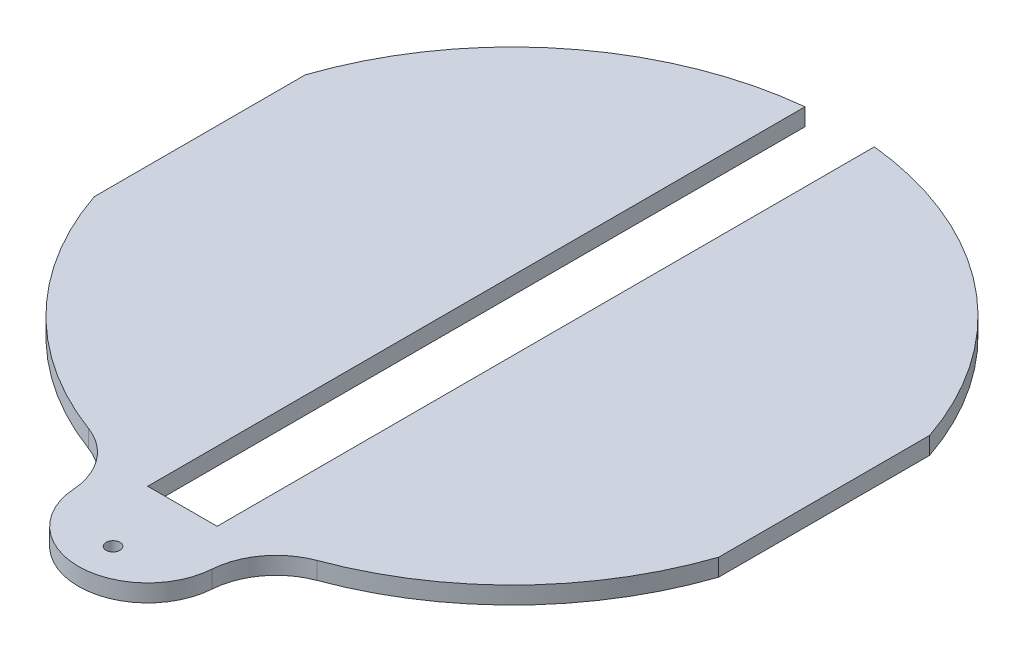
ISO-10303-21;
HEADER;
FILE_DESCRIPTION(('STEP AP214'),'2;1');
FILE_NAME('part.step','',(''),(''),'','','');
FILE_SCHEMA(('AUTOMOTIVE_DESIGN { 1 0 10303 214 1 1 1 1 }'));
ENDSEC;
DATA;
#1=APPLICATION_CONTEXT('core data for automotive mechanical design processes');
#2=APPLICATION_PROTOCOL_DEFINITION('international standard','automotive_design',2000,#1);
#3=PRODUCT_CONTEXT('',#1,'mechanical');
#4=PRODUCT('Part','Part','',(#3));
#5=PRODUCT_RELATED_PRODUCT_CATEGORY('part','',(#4));
#6=PRODUCT_DEFINITION_FORMATION('','',#4);
#7=PRODUCT_DEFINITION_CONTEXT('part definition',#1,'design');
#8=PRODUCT_DEFINITION('design','',#6,#7);
#9=PRODUCT_DEFINITION_SHAPE('','',#8);
#10=(LENGTH_UNIT() NAMED_UNIT(*) SI_UNIT(.MILLI.,.METRE.));
#11=(NAMED_UNIT(*) PLANE_ANGLE_UNIT() SI_UNIT($,.RADIAN.));
#12=(NAMED_UNIT(*) SI_UNIT($,.STERADIAN.) SOLID_ANGLE_UNIT());
#13=UNCERTAINTY_MEASURE_WITH_UNIT(LENGTH_MEASURE(1.E-05),#10,'distance_accuracy_value','');
#14=(GEOMETRIC_REPRESENTATION_CONTEXT(3) GLOBAL_UNCERTAINTY_ASSIGNED_CONTEXT((#13)) GLOBAL_UNIT_ASSIGNED_CONTEXT((#10,
#11,#12)) REPRESENTATION_CONTEXT('',''));
#15=CARTESIAN_POINT('',(0.,0.,0.));
#16=DIRECTION('',(0.,0.,1.));
#17=DIRECTION('',(1.,0.,0.));
#18=AXIS2_PLACEMENT_3D('',#15,#16,#17);
#19=CARTESIAN_POINT('',(-57.15,3.175,63.5));
#20=DIRECTION('',(-1.,0.,0.));
#21=DIRECTION('',(0.,0.,1.));
#22=AXIS2_PLACEMENT_3D('',#19,#20,#21);
#23=PLANE('',#22);
#24=DIRECTION('',(0.,0.,-1.));
#25=VECTOR('',#24,1.);
#26=CARTESIAN_POINT('',(-57.15,3.175,63.5));
#27=LINE('',#26,#25);
#28=CARTESIAN_POINT('',(-57.15,3.175,16.1377710336968));
#29=VERTEX_POINT('',#28);
#30=CARTESIAN_POINT('',(-57.15,3.175,-22.4877710336968));
#31=VERTEX_POINT('',#30);
#32=EDGE_CURVE('E174',#29,#31,#27,.T.);
#33=ORIENTED_EDGE('',*,*,#32,.T.);
#34=DIRECTION('',(0.,1.,0.));
#35=VECTOR('',#34,1.);
#36=CARTESIAN_POINT('',(-57.15,0.,-22.4877710336968));
#37=LINE('',#36,#35);
#38=CARTESIAN_POINT('',(-57.15,0.,-22.4877710336968));
#39=VERTEX_POINT('',#38);
#40=EDGE_CURVE('E236',#39,#31,#37,.T.);
#41=ORIENTED_EDGE('',*,*,#40,.F.);
#42=DIRECTION('',(0.,0.,-1.));
#43=VECTOR('',#42,1.);
#44=CARTESIAN_POINT('',(-57.15,0.,63.5));
#45=LINE('',#44,#43);
#46=CARTESIAN_POINT('',(-57.15,0.,16.1377710336968));
#47=VERTEX_POINT('',#46);
#48=EDGE_CURVE('E251',#47,#39,#45,.T.);
#49=ORIENTED_EDGE('',*,*,#48,.F.);
#50=DIRECTION('',(0.,1.,0.));
#51=VECTOR('',#50,1.);
#52=CARTESIAN_POINT('',(-57.15,0.,16.1377710336968));
#53=LINE('',#52,#51);
#54=EDGE_CURVE('E192',#47,#29,#53,.T.);
#55=ORIENTED_EDGE('',*,*,#54,.T.);
#56=EDGE_LOOP('',(#33,#41,#49,#55));
#57=FACE_BOUND('',#56,.T.);
#58=ADVANCED_FACE('F43',(#57),#23,.T.);
#59=CARTESIAN_POINT('',(57.15,3.175,63.5));
#60=DIRECTION('',(-1.,0.,0.));
#61=DIRECTION('',(0.,0.,1.));
#62=AXIS2_PLACEMENT_3D('',#59,#60,#61);
#63=PLANE('',#62);
#64=DIRECTION('',(0.,1.,0.));
#65=VECTOR('',#64,1.);
#66=CARTESIAN_POINT('',(57.15,0.,16.1377710336969));
#67=LINE('',#66,#65);
#68=CARTESIAN_POINT('',(57.15,0.,16.1377710336969));
#69=VERTEX_POINT('',#68);
#70=CARTESIAN_POINT('',(57.15,3.175,16.1377710336969));
#71=VERTEX_POINT('',#70);
#72=EDGE_CURVE('E244',#69,#71,#67,.T.);
#73=ORIENTED_EDGE('',*,*,#72,.F.);
#74=DIRECTION('',(0.,0.,-1.));
#75=VECTOR('',#74,1.);
#76=CARTESIAN_POINT('',(57.15,0.,63.5));
#77=LINE('',#76,#75);
#78=CARTESIAN_POINT('',(57.15,0.,-22.4877710336969));
#79=VERTEX_POINT('',#78);
#80=EDGE_CURVE('E161',#69,#79,#77,.T.);
#81=ORIENTED_EDGE('',*,*,#80,.T.);
#82=DIRECTION('',(0.,1.,0.));
#83=VECTOR('',#82,1.);
#84=CARTESIAN_POINT('',(57.15,0.,-22.4877710336969));
#85=LINE('',#84,#83);
#86=CARTESIAN_POINT('',(57.15,3.175,-22.4877710336969));
#87=VERTEX_POINT('',#86);
#88=EDGE_CURVE('E138',#79,#87,#85,.T.);
#89=ORIENTED_EDGE('',*,*,#88,.T.);
#90=DIRECTION('',(0.,0.,-1.));
#91=VECTOR('',#90,1.);
#92=CARTESIAN_POINT('',(57.15,3.175,63.5));
#93=LINE('',#92,#91);
#94=EDGE_CURVE('E186',#71,#87,#93,.T.);
#95=ORIENTED_EDGE('',*,*,#94,.F.);
#96=EDGE_LOOP('',(#73,#81,#89,#95));
#97=FACE_BOUND('',#96,.T.);
#98=ADVANCED_FACE('F284',(#97),#63,.F.);
#99=CARTESIAN_POINT('',(6.35,3.175,57.15));
#100=DIRECTION('',(-1.,0.,0.));
#101=DIRECTION('',(0.,0.,1.));
#102=AXIS2_PLACEMENT_3D('',#99,#100,#101);
#103=PLANE('',#102);
#104=DIRECTION('',(0.,0.,-1.));
#105=VECTOR('',#104,1.);
#106=CARTESIAN_POINT('',(6.35,3.175,57.15));
#107=LINE('',#106,#105);
#108=CARTESIAN_POINT('',(6.35,3.175,57.15));
#109=VERTEX_POINT('',#108);
#110=CARTESIAN_POINT('',(6.35,3.175,-63.1648585179195));
#111=VERTEX_POINT('',#110);
#112=EDGE_CURVE('E151',#109,#111,#107,.T.);
#113=ORIENTED_EDGE('',*,*,#112,.T.);
#114=DIRECTION('',(0.,1.,0.));
#115=VECTOR('',#114,1.);
#116=CARTESIAN_POINT('',(6.35,0.,-63.1648585179195));
#117=LINE('',#116,#115);
#118=CARTESIAN_POINT('',(6.35,0.,-63.1648585179195));
#119=VERTEX_POINT('',#118);
#120=EDGE_CURVE('E135',#119,#111,#117,.T.);
#121=ORIENTED_EDGE('',*,*,#120,.F.);
#122=DIRECTION('',(0.,0.,-1.));
#123=VECTOR('',#122,1.);
#124=CARTESIAN_POINT('',(6.35,0.,57.15));
#125=LINE('',#124,#123);
#126=CARTESIAN_POINT('',(6.35,0.,57.15));
#127=VERTEX_POINT('',#126);
#128=EDGE_CURVE('E148',#127,#119,#125,.T.);
#129=ORIENTED_EDGE('',*,*,#128,.F.);
#130=DIRECTION('',(0.,-1.,0.));
#131=VECTOR('',#130,1.);
#132=CARTESIAN_POINT('',(6.35,3.175,57.15));
#133=LINE('',#132,#131);
#134=EDGE_CURVE('E175',#109,#127,#133,.T.);
#135=ORIENTED_EDGE('',*,*,#134,.F.);
#136=EDGE_LOOP('',(#113,#121,#129,#135));
#137=FACE_BOUND('',#136,.T.);
#138=ADVANCED_FACE('F147',(#137),#103,.T.);
#139=CARTESIAN_POINT('',(-6.35,3.175,57.15));
#140=DIRECTION('',(-1.,0.,0.));
#141=DIRECTION('',(0.,0.,1.));
#142=AXIS2_PLACEMENT_3D('',#139,#140,#141);
#143=PLANE('',#142);
#144=DIRECTION('',(0.,1.,0.));
#145=VECTOR('',#144,1.);
#146=CARTESIAN_POINT('',(-6.35,0.,-63.1648585179195));
#147=LINE('',#146,#145);
#148=CARTESIAN_POINT('',(-6.35,0.,-63.1648585179195));
#149=VERTEX_POINT('',#148);
#150=CARTESIAN_POINT('',(-6.35,3.175,-63.1648585179195));
#151=VERTEX_POINT('',#150);
#152=EDGE_CURVE('E241',#149,#151,#147,.T.);
#153=ORIENTED_EDGE('',*,*,#152,.T.);
#154=DIRECTION('',(0.,0.,-1.));
#155=VECTOR('',#154,1.);
#156=CARTESIAN_POINT('',(-6.35,3.175,57.15));
#157=LINE('',#156,#155);
#158=CARTESIAN_POINT('',(-6.35,3.175,57.15));
#159=VERTEX_POINT('',#158);
#160=EDGE_CURVE('E258',#159,#151,#157,.T.);
#161=ORIENTED_EDGE('',*,*,#160,.F.);
#162=DIRECTION('',(0.,-1.,0.));
#163=VECTOR('',#162,1.);
#164=CARTESIAN_POINT('',(-6.35,3.175,57.15));
#165=LINE('',#164,#163);
#166=CARTESIAN_POINT('',(-6.35,0.,57.15));
#167=VERTEX_POINT('',#166);
#168=EDGE_CURVE('E179',#159,#167,#165,.T.);
#169=ORIENTED_EDGE('',*,*,#168,.T.);
#170=DIRECTION('',(0.,0.,-1.));
#171=VECTOR('',#170,1.);
#172=CARTESIAN_POINT('',(-6.35,0.,57.15));
#173=LINE('',#172,#171);
#174=EDGE_CURVE('E167',#167,#149,#173,.T.);
#175=ORIENTED_EDGE('',*,*,#174,.T.);
#176=EDGE_LOOP('',(#153,#161,#169,#175));
#177=FACE_BOUND('',#176,.T.);
#178=ADVANCED_FACE('F275',(#177),#143,.F.);
#179=CARTESIAN_POINT('',(0.,3.175,63.5));
#180=DIRECTION('',(0.,1.,0.));
#181=DIRECTION('',(0.,0.,1.));
#182=AXIS2_PLACEMENT_3D('',#179,#180,#181);
#183=PLANE('',#182);
#184=CARTESIAN_POINT('',(0.,3.175,69.85));
#185=DIRECTION('',(0.,1.,0.));
#186=DIRECTION('',(0.,0.,1.));
#187=AXIS2_PLACEMENT_3D('',#184,#185,#186);
#188=CIRCLE('',#187,1.27000000000001);
#189=CARTESIAN_POINT('',(0.,3.175,71.12));
#190=VERTEX_POINT('',#189);
#191=EDGE_CURVE('E202',#190,#190,#188,.T.);
#192=ORIENTED_EDGE('',*,*,#191,.F.);
#193=EDGE_LOOP('',(#192));
#194=FACE_BOUND('',#193,.T.);
#195=ORIENTED_EDGE('',*,*,#160,.T.);
#196=CARTESIAN_POINT('',(0.,3.175,-3.17500000000002));
#197=DIRECTION('',(0.,1.,0.));
#198=DIRECTION('',(0.,0.,1.));
#199=AXIS2_PLACEMENT_3D('',#196,#197,#198);
#200=CIRCLE('',#199,60.325);
#201=EDGE_CURVE('E198',#151,#31,#200,.T.);
#202=ORIENTED_EDGE('',*,*,#201,.T.);
#203=ORIENTED_EDGE('',*,*,#32,.F.);
#204=CARTESIAN_POINT('',(0.,3.175,-3.17500000000002));
#205=DIRECTION('',(0.,1.,0.));
#206=DIRECTION('',(0.,0.,1.));
#207=AXIS2_PLACEMENT_3D('',#204,#205,#206);
#208=CIRCLE('',#207,60.325);
#209=CARTESIAN_POINT('',(-20.9290131836114,3.175,53.4031055900621));
#210=VERTEX_POINT('',#209);
#211=EDGE_CURVE('E187',#29,#210,#208,.T.);
#212=ORIENTED_EDGE('',*,*,#211,.T.);
#213=CARTESIAN_POINT('',(-25.3351212222665,3.175,65.3142857142857));
#214=DIRECTION('',(0.,1.,0.));
#215=DIRECTION('',(0.,0.,1.));
#216=AXIS2_PLACEMENT_3D('',#213,#214,#215);
#217=CIRCLE('',#216,12.7);
#218=CARTESIAN_POINT('',(-12.6675606111333,3.175,64.4071428571429));
#219=VERTEX_POINT('',#218);
#220=EDGE_CURVE('E52',#210,#219,#217,.F.);
#221=ORIENTED_EDGE('',*,*,#220,.T.);
#222=CARTESIAN_POINT('',(0.,3.175,63.5));
#223=DIRECTION('',(0.,1.,0.));
#224=DIRECTION('',(0.,0.,1.));
#225=AXIS2_PLACEMENT_3D('',#222,#223,#224);
#226=CIRCLE('',#225,12.7);
#227=CARTESIAN_POINT('',(12.6675606111333,3.175,64.4071428571428));
#228=VERTEX_POINT('',#227);
#229=EDGE_CURVE('E182',#219,#228,#226,.T.);
#230=ORIENTED_EDGE('',*,*,#229,.T.);
#231=CARTESIAN_POINT('',(25.3351212222665,3.175,65.3142857142857));
#232=DIRECTION('',(0.,1.,0.));
#233=DIRECTION('',(0.,0.,1.));
#234=AXIS2_PLACEMENT_3D('',#231,#232,#233);
#235=CIRCLE('',#234,12.7);
#236=CARTESIAN_POINT('',(20.9290131836115,3.175,53.4031055900621));
#237=VERTEX_POINT('',#236);
#238=EDGE_CURVE('E215',#228,#237,#235,.F.);
#239=ORIENTED_EDGE('',*,*,#238,.T.);
#240=CARTESIAN_POINT('',(0.,3.175,-3.17500000000002));
#241=DIRECTION('',(0.,1.,0.));
#242=DIRECTION('',(0.,0.,1.));
#243=AXIS2_PLACEMENT_3D('',#240,#241,#242);
#244=CIRCLE('',#243,60.325);
#245=EDGE_CURVE('E195',#237,#71,#244,.T.);
#246=ORIENTED_EDGE('',*,*,#245,.T.);
#247=ORIENTED_EDGE('',*,*,#94,.T.);
#248=CARTESIAN_POINT('',(0.,3.175,-3.17500000000002));
#249=DIRECTION('',(0.,1.,0.));
#250=DIRECTION('',(0.,0.,1.));
#251=AXIS2_PLACEMENT_3D('',#248,#249,#250);
#252=CIRCLE('',#251,60.325);
#253=EDGE_CURVE('E191',#87,#111,#252,.T.);
#254=ORIENTED_EDGE('',*,*,#253,.T.);
#255=ORIENTED_EDGE('',*,*,#112,.F.);
#256=DIRECTION('',(1.,0.,0.));
#257=VECTOR('',#256,1.);
#258=CARTESIAN_POINT('',(-6.35,3.175,57.15));
#259=LINE('',#258,#257);
#260=EDGE_CURVE('E261',#159,#109,#259,.T.);
#261=ORIENTED_EDGE('',*,*,#260,.F.);
#262=EDGE_LOOP('',(#195,#202,#203,#212,#221,#230,#239,#246,#247,#254,#255,#261));
#263=FACE_BOUND('',#262,.T.);
#264=ADVANCED_FACE('F224',(#194,#263),#183,.T.);
#265=CARTESIAN_POINT('',(0.,0.,63.5));
#266=DIRECTION('',(0.,1.,0.));
#267=DIRECTION('',(0.,0.,1.));
#268=AXIS2_PLACEMENT_3D('',#265,#266,#267);
#269=PLANE('',#268);
#270=CARTESIAN_POINT('',(0.,0.,69.85));
#271=DIRECTION('',(0.,1.,0.));
#272=DIRECTION('',(0.,0.,1.));
#273=AXIS2_PLACEMENT_3D('',#270,#271,#272);
#274=CIRCLE('',#273,1.27000000000001);
#275=CARTESIAN_POINT('',(0.,0.,71.12));
#276=VERTEX_POINT('',#275);
#277=EDGE_CURVE('E247',#276,#276,#274,.T.);
#278=ORIENTED_EDGE('',*,*,#277,.T.);
#279=EDGE_LOOP('',(#278));
#280=FACE_BOUND('',#279,.T.);
#281=CARTESIAN_POINT('',(0.,0.,-3.17500000000002));
#282=DIRECTION('',(0.,1.,0.));
#283=DIRECTION('',(0.,0.,1.));
#284=AXIS2_PLACEMENT_3D('',#281,#282,#283);
#285=CIRCLE('',#284,60.325);
#286=EDGE_CURVE('E277',#149,#39,#285,.T.);
#287=ORIENTED_EDGE('',*,*,#286,.F.);
#288=ORIENTED_EDGE('',*,*,#174,.F.);
#289=DIRECTION('',(1.,0.,0.));
#290=VECTOR('',#289,1.);
#291=CARTESIAN_POINT('',(-6.35,0.,57.15));
#292=LINE('',#291,#290);
#293=EDGE_CURVE('E159',#167,#127,#292,.T.);
#294=ORIENTED_EDGE('',*,*,#293,.T.);
#295=ORIENTED_EDGE('',*,*,#128,.T.);
#296=CARTESIAN_POINT('',(0.,0.,-3.17500000000002));
#297=DIRECTION('',(0.,1.,0.));
#298=DIRECTION('',(0.,0.,1.));
#299=AXIS2_PLACEMENT_3D('',#296,#297,#298);
#300=CIRCLE('',#299,60.325);
#301=EDGE_CURVE('E132',#79,#119,#300,.T.);
#302=ORIENTED_EDGE('',*,*,#301,.F.);
#303=ORIENTED_EDGE('',*,*,#80,.F.);
#304=CARTESIAN_POINT('',(0.,0.,-3.17500000000002));
#305=DIRECTION('',(0.,1.,0.));
#306=DIRECTION('',(0.,0.,1.));
#307=AXIS2_PLACEMENT_3D('',#304,#305,#306);
#308=CIRCLE('',#307,60.325);
#309=CARTESIAN_POINT('',(20.9290131836115,0.,53.4031055900621));
#310=VERTEX_POINT('',#309);
#311=EDGE_CURVE('E153',#310,#69,#308,.T.);
#312=ORIENTED_EDGE('',*,*,#311,.F.);
#313=CARTESIAN_POINT('',(25.3351212222665,0.,65.3142857142857));
#314=DIRECTION('',(0.,1.,0.));
#315=DIRECTION('',(0.,0.,1.));
#316=AXIS2_PLACEMENT_3D('',#313,#314,#315);
#317=CIRCLE('',#316,12.7);
#318=CARTESIAN_POINT('',(12.6675606111333,0.,64.4071428571428));
#319=VERTEX_POINT('',#318);
#320=EDGE_CURVE('E218',#310,#319,#317,.T.);
#321=ORIENTED_EDGE('',*,*,#320,.T.);
#322=CARTESIAN_POINT('',(0.,0.,63.5));
#323=DIRECTION('',(0.,1.,0.));
#324=DIRECTION('',(0.,0.,1.));
#325=AXIS2_PLACEMENT_3D('',#322,#323,#324);
#326=CIRCLE('',#325,12.7);
#327=CARTESIAN_POINT('',(-12.6675606111333,0.,64.4071428571429));
#328=VERTEX_POINT('',#327);
#329=EDGE_CURVE('E165',#328,#319,#326,.T.);
#330=ORIENTED_EDGE('',*,*,#329,.F.);
#331=CARTESIAN_POINT('',(-25.3351212222665,0.,65.3142857142857));
#332=DIRECTION('',(0.,1.,0.));
#333=DIRECTION('',(0.,0.,1.));
#334=AXIS2_PLACEMENT_3D('',#331,#332,#333);
#335=CIRCLE('',#334,12.7);
#336=CARTESIAN_POINT('',(-20.9290131836114,0.,53.4031055900621));
#337=VERTEX_POINT('',#336);
#338=EDGE_CURVE('E11',#328,#337,#335,.T.);
#339=ORIENTED_EDGE('',*,*,#338,.T.);
#340=CARTESIAN_POINT('',(0.,0.,-3.17500000000002));
#341=DIRECTION('',(0.,1.,0.));
#342=DIRECTION('',(0.,0.,1.));
#343=AXIS2_PLACEMENT_3D('',#340,#341,#342);
#344=CIRCLE('',#343,60.325);
#345=EDGE_CURVE('E232',#47,#337,#344,.T.);
#346=ORIENTED_EDGE('',*,*,#345,.F.);
#347=ORIENTED_EDGE('',*,*,#48,.T.);
#348=EDGE_LOOP('',(#287,#288,#294,#295,#302,#303,#312,#321,#330,#339,#346,#347));
#349=FACE_BOUND('',#348,.T.);
#350=ADVANCED_FACE('F156',(#280,#349),#269,.F.);
#351=CARTESIAN_POINT('',(0.,3.175,63.5));
#352=DIRECTION('',(0.,-1.,0.));
#353=DIRECTION('',(0.,0.,-1.));
#354=AXIS2_PLACEMENT_3D('',#351,#352,#353);
#355=CYLINDRICAL_SURFACE('',#354,12.7);
#356=ORIENTED_EDGE('',*,*,#329,.T.);
#357=DIRECTION('',(0.,-1.,0.));
#358=VECTOR('',#357,1.);
#359=CARTESIAN_POINT('',(12.6675606111333,3.175,64.4071428571428));
#360=LINE('',#359,#358);
#361=EDGE_CURVE('E205',#319,#228,#360,.F.);
#362=ORIENTED_EDGE('',*,*,#361,.T.);
#363=ORIENTED_EDGE('',*,*,#229,.F.);
#364=DIRECTION('',(0.,-1.,0.));
#365=VECTOR('',#364,1.);
#366=CARTESIAN_POINT('',(-12.6675606111333,3.175,64.4071428571429));
#367=LINE('',#366,#365);
#368=EDGE_CURVE('E178',#219,#328,#367,.T.);
#369=ORIENTED_EDGE('',*,*,#368,.T.);
#370=EDGE_LOOP('',(#356,#362,#363,#369));
#371=FACE_BOUND('',#370,.T.);
#372=ADVANCED_FACE('F227',(#371),#355,.T.);
#373=CARTESIAN_POINT('',(-6.35,3.175,57.15));
#374=DIRECTION('',(0.,0.,-1.));
#375=DIRECTION('',(-1.,0.,0.));
#376=AXIS2_PLACEMENT_3D('',#373,#374,#375);
#377=PLANE('',#376);
#378=ORIENTED_EDGE('',*,*,#293,.F.);
#379=ORIENTED_EDGE('',*,*,#168,.F.);
#380=ORIENTED_EDGE('',*,*,#260,.T.);
#381=ORIENTED_EDGE('',*,*,#134,.T.);
#382=EDGE_LOOP('',(#378,#379,#380,#381));
#383=FACE_BOUND('',#382,.T.);
#384=ADVANCED_FACE('F279',(#383),#377,.T.);
#385=CARTESIAN_POINT('',(0.,0.,69.85));
#386=DIRECTION('',(0.,1.,0.));
#387=DIRECTION('',(0.,0.,1.));
#388=AXIS2_PLACEMENT_3D('',#385,#386,#387);
#389=CYLINDRICAL_SURFACE('',#388,1.27000000000001);
#390=ORIENTED_EDGE('',*,*,#277,.F.);
#391=EDGE_LOOP('',(#390));
#392=FACE_BOUND('',#391,.T.);
#393=ORIENTED_EDGE('',*,*,#191,.T.);
#394=EDGE_LOOP('',(#393));
#395=FACE_BOUND('',#394,.T.);
#396=ADVANCED_FACE('F322',(#392,#395),#389,.F.);
#397=CARTESIAN_POINT('',(0.,0.,-3.17500000000002));
#398=DIRECTION('',(0.,1.,0.));
#399=DIRECTION('',(0.,0.,1.));
#400=AXIS2_PLACEMENT_3D('',#397,#398,#399);
#401=CYLINDRICAL_SURFACE('',#400,60.325);
#402=ORIENTED_EDGE('',*,*,#345,.T.);
#403=DIRECTION('',(0.,1.,0.));
#404=VECTOR('',#403,1.);
#405=CARTESIAN_POINT('',(-20.9290131836114,0.,53.4031055900621));
#406=LINE('',#405,#404);
#407=EDGE_CURVE('E212',#337,#210,#406,.T.);
#408=ORIENTED_EDGE('',*,*,#407,.T.);
#409=ORIENTED_EDGE('',*,*,#211,.F.);
#410=ORIENTED_EDGE('',*,*,#54,.F.);
#411=EDGE_LOOP('',(#402,#408,#409,#410));
#412=FACE_BOUND('',#411,.T.);
#413=ADVANCED_FACE('F230',(#412),#401,.T.);
#414=CARTESIAN_POINT('',(0.,0.,-3.17500000000002));
#415=DIRECTION('',(0.,1.,0.));
#416=DIRECTION('',(0.,0.,1.));
#417=AXIS2_PLACEMENT_3D('',#414,#415,#416);
#418=CYLINDRICAL_SURFACE('',#417,60.325);
#419=ORIENTED_EDGE('',*,*,#88,.F.);
#420=ORIENTED_EDGE('',*,*,#301,.T.);
#421=ORIENTED_EDGE('',*,*,#120,.T.);
#422=ORIENTED_EDGE('',*,*,#253,.F.);
#423=EDGE_LOOP('',(#419,#420,#421,#422));
#424=FACE_BOUND('',#423,.T.);
#425=ADVANCED_FACE('F134',(#424),#418,.T.);
#426=CARTESIAN_POINT('',(0.,0.,-3.17500000000002));
#427=DIRECTION('',(0.,1.,0.));
#428=DIRECTION('',(0.,0.,1.));
#429=AXIS2_PLACEMENT_3D('',#426,#427,#428);
#430=CYLINDRICAL_SURFACE('',#429,60.325);
#431=ORIENTED_EDGE('',*,*,#245,.F.);
#432=DIRECTION('',(0.,1.,0.));
#433=VECTOR('',#432,1.);
#434=CARTESIAN_POINT('',(20.9290131836115,0.,53.4031055900621));
#435=LINE('',#434,#433);
#436=EDGE_CURVE('E209',#237,#310,#435,.F.);
#437=ORIENTED_EDGE('',*,*,#436,.T.);
#438=ORIENTED_EDGE('',*,*,#311,.T.);
#439=ORIENTED_EDGE('',*,*,#72,.T.);
#440=EDGE_LOOP('',(#431,#437,#438,#439));
#441=FACE_BOUND('',#440,.T.);
#442=ADVANCED_FACE('F297',(#441),#430,.T.);
#443=CARTESIAN_POINT('',(0.,0.,-3.17500000000002));
#444=DIRECTION('',(0.,1.,0.));
#445=DIRECTION('',(0.,0.,1.));
#446=AXIS2_PLACEMENT_3D('',#443,#444,#445);
#447=CYLINDRICAL_SURFACE('',#446,60.325);
#448=ORIENTED_EDGE('',*,*,#152,.F.);
#449=ORIENTED_EDGE('',*,*,#286,.T.);
#450=ORIENTED_EDGE('',*,*,#40,.T.);
#451=ORIENTED_EDGE('',*,*,#201,.F.);
#452=EDGE_LOOP('',(#448,#449,#450,#451));
#453=FACE_BOUND('',#452,.T.);
#454=ADVANCED_FACE('F303',(#453),#447,.T.);
#455=CARTESIAN_POINT('',(25.3351212222665,0.,65.3142857142857));
#456=DIRECTION('',(0.,-1.,0.));
#457=DIRECTION('',(0.,0.,-1.));
#458=AXIS2_PLACEMENT_3D('',#455,#456,#457);
#459=CYLINDRICAL_SURFACE('',#458,12.7);
#460=ORIENTED_EDGE('',*,*,#320,.F.);
#461=ORIENTED_EDGE('',*,*,#436,.F.);
#462=ORIENTED_EDGE('',*,*,#238,.F.);
#463=ORIENTED_EDGE('',*,*,#361,.F.);
#464=EDGE_LOOP('',(#460,#461,#462,#463));
#465=FACE_BOUND('',#464,.T.);
#466=ADVANCED_FACE('F301',(#465),#459,.F.);
#467=CARTESIAN_POINT('',(-25.3351212222665,3.175,65.3142857142857));
#468=DIRECTION('',(0.,-1.,0.));
#469=DIRECTION('',(0.,0.,-1.));
#470=AXIS2_PLACEMENT_3D('',#467,#468,#469);
#471=CYLINDRICAL_SURFACE('',#470,12.7);
#472=ORIENTED_EDGE('',*,*,#338,.F.);
#473=ORIENTED_EDGE('',*,*,#368,.F.);
#474=ORIENTED_EDGE('',*,*,#220,.F.);
#475=ORIENTED_EDGE('',*,*,#407,.F.);
#476=EDGE_LOOP('',(#472,#473,#474,#475));
#477=FACE_BOUND('',#476,.T.);
#478=ADVANCED_FACE('F45',(#477),#471,.F.);
#479=CLOSED_SHELL('',(#58,#98,#138,#178,#264,#350,#372,#384,#396,#413,#425,#442,#454,#466,#478));
#480=MANIFOLD_SOLID_BREP('B2',#479);
#481=ADVANCED_BREP_SHAPE_REPRESENTATION('',(#18,#480),#14);
#482=SHAPE_DEFINITION_REPRESENTATION(#9,#481);
ENDSEC;
END-ISO-10303-21;
